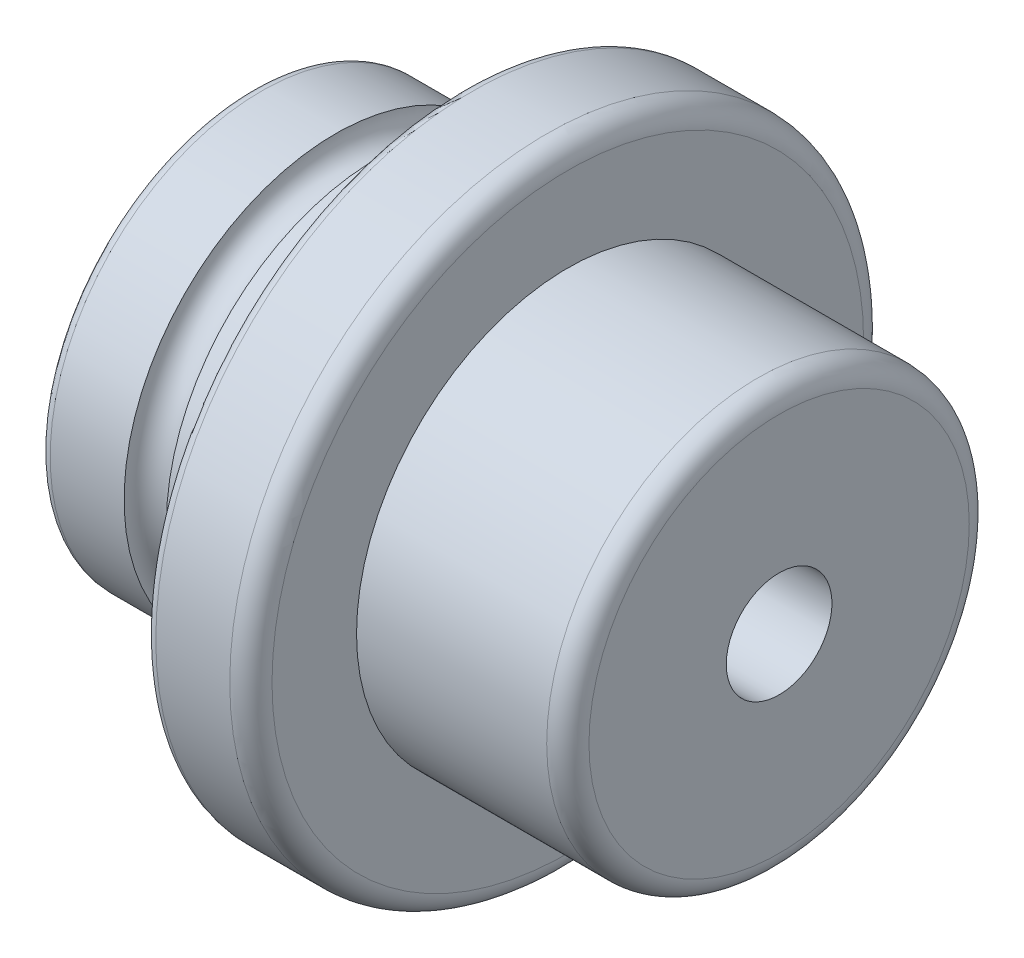
ISO-10303-21;
HEADER;
FILE_DESCRIPTION(('STEP AP214'),'2;1');
FILE_NAME('part.step','',(''),(''),'','','');
FILE_SCHEMA(('AUTOMOTIVE_DESIGN { 1 0 10303 214 1 1 1 1 }'));
ENDSEC;
DATA;
#1=APPLICATION_CONTEXT('core data for automotive mechanical design processes');
#2=APPLICATION_PROTOCOL_DEFINITION('international standard','automotive_design',2000,#1);
#3=PRODUCT_CONTEXT('',#1,'mechanical');
#4=PRODUCT('Part','Part','',(#3));
#5=PRODUCT_RELATED_PRODUCT_CATEGORY('part','',(#4));
#6=PRODUCT_DEFINITION_FORMATION('','',#4);
#7=PRODUCT_DEFINITION_CONTEXT('part definition',#1,'design');
#8=PRODUCT_DEFINITION('design','',#6,#7);
#9=PRODUCT_DEFINITION_SHAPE('','',#8);
#10=(LENGTH_UNIT() NAMED_UNIT(*) SI_UNIT(.MILLI.,.METRE.));
#11=(NAMED_UNIT(*) PLANE_ANGLE_UNIT() SI_UNIT($,.RADIAN.));
#12=(NAMED_UNIT(*) SI_UNIT($,.STERADIAN.) SOLID_ANGLE_UNIT());
#13=UNCERTAINTY_MEASURE_WITH_UNIT(LENGTH_MEASURE(1.E-05),#10,'distance_accuracy_value','');
#14=(GEOMETRIC_REPRESENTATION_CONTEXT(3) GLOBAL_UNCERTAINTY_ASSIGNED_CONTEXT((#13)) GLOBAL_UNIT_ASSIGNED_CONTEXT((#10,
#11,#12)) REPRESENTATION_CONTEXT('',''));
#15=CARTESIAN_POINT('',(0.,0.,0.));
#16=DIRECTION('',(0.,0.,1.));
#17=DIRECTION('',(1.,0.,0.));
#18=AXIS2_PLACEMENT_3D('',#15,#16,#17);
#19=CARTESIAN_POINT('',(0.,0.,0.));
#20=DIRECTION('',(-1.,0.,0.));
#21=DIRECTION('',(0.,0.,1.));
#22=AXIS2_PLACEMENT_3D('',#19,#20,#21);
#23=CYLINDRICAL_SURFACE('',#22,20.);
#24=CARTESIAN_POINT('',(12.,0.,0.));
#25=DIRECTION('',(-1.,0.,0.));
#26=DIRECTION('',(0.,0.,1.));
#27=AXIS2_PLACEMENT_3D('',#24,#25,#26);
#28=CIRCLE('',#27,20.);
#29=CARTESIAN_POINT('',(12.,0.,20.));
#30=VERTEX_POINT('',#29);
#31=EDGE_CURVE('E66',#30,#30,#28,.F.);
#32=ORIENTED_EDGE('',*,*,#31,.T.);
#33=EDGE_LOOP('',(#32));
#34=FACE_BOUND('',#33,.T.);
#35=CARTESIAN_POINT('',(20.,0.,0.));
#36=DIRECTION('',(-1.,0.,0.));
#37=DIRECTION('',(0.,0.,1.));
#38=AXIS2_PLACEMENT_3D('',#35,#36,#37);
#39=CIRCLE('',#38,20.);
#40=CARTESIAN_POINT('',(20.,0.,20.));
#41=VERTEX_POINT('',#40);
#42=EDGE_CURVE('E69',#41,#41,#39,.T.);
#43=ORIENTED_EDGE('',*,*,#42,.T.);
#44=EDGE_LOOP('',(#43));
#45=FACE_BOUND('',#44,.T.);
#46=ADVANCED_FACE('F33',(#34,#45),#23,.T.);
#47=CARTESIAN_POINT('',(0.,20.,0.));
#48=DIRECTION('',(1.,0.,0.));
#49=DIRECTION('',(0.,0.,-1.));
#50=AXIS2_PLACEMENT_3D('',#47,#48,#49);
#51=PLANE('',#50);
#52=CARTESIAN_POINT('',(0.,0.,0.));
#53=DIRECTION('',(1.,0.,0.));
#54=DIRECTION('',(0.,0.,-1.));
#55=AXIS2_PLACEMENT_3D('',#52,#53,#54);
#56=CIRCLE('',#55,19.);
#57=CARTESIAN_POINT('',(0.,0.,-19.));
#58=VERTEX_POINT('',#57);
#59=EDGE_CURVE('E62',#58,#58,#56,.F.);
#60=ORIENTED_EDGE('',*,*,#59,.T.);
#61=EDGE_LOOP('',(#60));
#62=FACE_BOUND('',#61,.T.);
#63=CARTESIAN_POINT('',(0.,0.,0.));
#64=DIRECTION('',(-1.,0.,0.));
#65=DIRECTION('',(0.,0.,1.));
#66=AXIS2_PLACEMENT_3D('',#63,#64,#65);
#67=CIRCLE('',#66,5.);
#68=CARTESIAN_POINT('',(0.,0.,5.));
#69=VERTEX_POINT('',#68);
#70=EDGE_CURVE('E65',#69,#69,#67,.T.);
#71=ORIENTED_EDGE('',*,*,#70,.F.);
#72=EDGE_LOOP('',(#71));
#73=FACE_BOUND('',#72,.T.);
#74=ADVANCED_FACE('F102',(#62,#73),#51,.F.);
#75=CARTESIAN_POINT('',(0.,0.,0.));
#76=DIRECTION('',(-1.,0.,0.));
#77=DIRECTION('',(0.,0.,1.));
#78=AXIS2_PLACEMENT_3D('',#75,#76,#77);
#79=CYLINDRICAL_SURFACE('',#78,5.);
#80=CARTESIAN_POINT('',(50.,0.,0.));
#81=DIRECTION('',(-1.,0.,0.));
#82=DIRECTION('',(0.,0.,1.));
#83=AXIS2_PLACEMENT_3D('',#80,#81,#82);
#84=CIRCLE('',#83,5.);
#85=CARTESIAN_POINT('',(50.,0.,5.));
#86=VERTEX_POINT('',#85);
#87=EDGE_CURVE('E75',#86,#86,#84,.T.);
#88=ORIENTED_EDGE('',*,*,#87,.F.);
#89=EDGE_LOOP('',(#88));
#90=FACE_BOUND('',#89,.T.);
#91=ORIENTED_EDGE('',*,*,#70,.T.);
#92=EDGE_LOOP('',(#91));
#93=FACE_BOUND('',#92,.T.);
#94=ADVANCED_FACE('F107',(#90,#93),#79,.F.);
#95=CARTESIAN_POINT('',(50.,5.,0.));
#96=DIRECTION('',(-1.,0.,0.));
#97=DIRECTION('',(0.,0.,1.));
#98=AXIS2_PLACEMENT_3D('',#95,#96,#97);
#99=PLANE('',#98);
#100=CARTESIAN_POINT('',(50.,0.,0.));
#101=DIRECTION('',(-1.,0.,0.));
#102=DIRECTION('',(0.,0.,1.));
#103=AXIS2_PLACEMENT_3D('',#100,#101,#102);
#104=CIRCLE('',#103,18.);
#105=CARTESIAN_POINT('',(50.,0.,18.));
#106=VERTEX_POINT('',#105);
#107=EDGE_CURVE('E10',#106,#106,#104,.F.);
#108=ORIENTED_EDGE('',*,*,#107,.T.);
#109=EDGE_LOOP('',(#108));
#110=FACE_BOUND('',#109,.T.);
#111=ORIENTED_EDGE('',*,*,#87,.T.);
#112=EDGE_LOOP('',(#111));
#113=FACE_BOUND('',#112,.T.);
#114=ADVANCED_FACE('F154',(#110,#113),#99,.F.);
#115=CARTESIAN_POINT('',(0.,0.,0.));
#116=DIRECTION('',(-1.,0.,0.));
#117=DIRECTION('',(0.,0.,1.));
#118=AXIS2_PLACEMENT_3D('',#115,#116,#117);
#119=CYLINDRICAL_SURFACE('',#118,20.);
#120=CARTESIAN_POINT('',(48.,0.,0.));
#121=DIRECTION('',(-1.,0.,0.));
#122=DIRECTION('',(0.,0.,1.));
#123=AXIS2_PLACEMENT_3D('',#120,#121,#122);
#124=CIRCLE('',#123,20.);
#125=CARTESIAN_POINT('',(48.,0.,20.));
#126=VERTEX_POINT('',#125);
#127=EDGE_CURVE('E40',#126,#126,#124,.T.);
#128=ORIENTED_EDGE('',*,*,#127,.T.);
#129=EDGE_LOOP('',(#128));
#130=FACE_BOUND('',#129,.T.);
#131=CARTESIAN_POINT('',(30.,0.,0.));
#132=DIRECTION('',(-1.,0.,0.));
#133=DIRECTION('',(0.,0.,1.));
#134=AXIS2_PLACEMENT_3D('',#131,#132,#133);
#135=CIRCLE('',#134,20.);
#136=CARTESIAN_POINT('',(30.,0.,20.));
#137=VERTEX_POINT('',#136);
#138=EDGE_CURVE('E78',#137,#137,#135,.T.);
#139=ORIENTED_EDGE('',*,*,#138,.F.);
#140=EDGE_LOOP('',(#139));
#141=FACE_BOUND('',#140,.T.);
#142=ADVANCED_FACE('F149',(#130,#141),#119,.T.);
#143=CARTESIAN_POINT('',(30.,20.,0.));
#144=DIRECTION('',(-1.,0.,0.));
#145=DIRECTION('',(0.,0.,1.));
#146=AXIS2_PLACEMENT_3D('',#143,#144,#145);
#147=PLANE('',#146);
#148=CARTESIAN_POINT('',(30.,0.,0.));
#149=DIRECTION('',(-1.,0.,0.));
#150=DIRECTION('',(0.,0.,1.));
#151=AXIS2_PLACEMENT_3D('',#148,#149,#150);
#152=CIRCLE('',#151,28.);
#153=CARTESIAN_POINT('',(30.,0.,28.));
#154=VERTEX_POINT('',#153);
#155=EDGE_CURVE('E44',#154,#154,#152,.F.);
#156=ORIENTED_EDGE('',*,*,#155,.T.);
#157=EDGE_LOOP('',(#156));
#158=FACE_BOUND('',#157,.T.);
#159=ORIENTED_EDGE('',*,*,#138,.T.);
#160=EDGE_LOOP('',(#159));
#161=FACE_BOUND('',#160,.T.);
#162=ADVANCED_FACE('F98',(#158,#161),#147,.F.);
#163=CARTESIAN_POINT('',(0.,0.,0.));
#164=DIRECTION('',(-1.,0.,0.));
#165=DIRECTION('',(0.,0.,1.));
#166=AXIS2_PLACEMENT_3D('',#163,#164,#165);
#167=CYLINDRICAL_SURFACE('',#166,30.);
#168=CARTESIAN_POINT('',(28.,0.,0.));
#169=DIRECTION('',(-1.,0.,0.));
#170=DIRECTION('',(0.,0.,1.));
#171=AXIS2_PLACEMENT_3D('',#168,#169,#170);
#172=CIRCLE('',#171,30.);
#173=CARTESIAN_POINT('',(28.,0.,30.));
#174=VERTEX_POINT('',#173);
#175=EDGE_CURVE('E48',#174,#174,#172,.T.);
#176=ORIENTED_EDGE('',*,*,#175,.T.);
#177=EDGE_LOOP('',(#176));
#178=FACE_BOUND('',#177,.T.);
#179=CARTESIAN_POINT('',(21.,0.,0.));
#180=DIRECTION('',(1.,0.,0.));
#181=DIRECTION('',(0.,0.,-1.));
#182=AXIS2_PLACEMENT_3D('',#179,#180,#181);
#183=CIRCLE('',#182,30.);
#184=CARTESIAN_POINT('',(21.,0.,-30.));
#185=VERTEX_POINT('',#184);
#186=EDGE_CURVE('E53',#185,#185,#183,.T.);
#187=ORIENTED_EDGE('',*,*,#186,.T.);
#188=EDGE_LOOP('',(#187));
#189=FACE_BOUND('',#188,.T.);
#190=ADVANCED_FACE('F88',(#178,#189),#167,.T.);
#191=CARTESIAN_POINT('',(20.,30.,0.));
#192=DIRECTION('',(1.,0.,0.));
#193=DIRECTION('',(0.,0.,-1.));
#194=AXIS2_PLACEMENT_3D('',#191,#192,#193);
#195=PLANE('',#194);
#196=CARTESIAN_POINT('',(20.,0.,0.));
#197=DIRECTION('',(1.,0.,0.));
#198=DIRECTION('',(0.,0.,-1.));
#199=AXIS2_PLACEMENT_3D('',#196,#197,#198);
#200=CIRCLE('',#199,29.);
#201=CARTESIAN_POINT('',(20.,0.,-29.));
#202=VERTEX_POINT('',#201);
#203=EDGE_CURVE('E56',#202,#202,#200,.F.);
#204=ORIENTED_EDGE('',*,*,#203,.T.);
#205=EDGE_LOOP('',(#204));
#206=FACE_BOUND('',#205,.T.);
#207=ORIENTED_EDGE('',*,*,#42,.F.);
#208=EDGE_LOOP('',(#207));
#209=FACE_BOUND('',#208,.T.);
#210=ADVANCED_FACE('F85',(#206,#209),#195,.F.);
#211=CARTESIAN_POINT('',(1.,0.,0.));
#212=DIRECTION('',(1.,0.,0.));
#213=DIRECTION('',(0.,0.,-1.));
#214=AXIS2_PLACEMENT_3D('',#211,#212,#213);
#215=CIRCLE('',#214,20.);
#216=CARTESIAN_POINT('',(1.,0.,-20.));
#217=VERTEX_POINT('',#216);
#218=EDGE_CURVE('E59',#217,#217,#215,.T.);
#219=ORIENTED_EDGE('',*,*,#218,.T.);
#220=EDGE_LOOP('',(#219));
#221=FACE_BOUND('',#220,.T.);
#222=CARTESIAN_POINT('',(8.,0.,0.));
#223=DIRECTION('',(1.,0.,0.));
#224=DIRECTION('',(0.,0.,-1.));
#225=AXIS2_PLACEMENT_3D('',#222,#223,#224);
#226=CIRCLE('',#225,20.);
#227=CARTESIAN_POINT('',(8.,0.,-20.));
#228=VERTEX_POINT('',#227);
#229=EDGE_CURVE('E70',#228,#228,#226,.F.);
#230=ORIENTED_EDGE('',*,*,#229,.T.);
#231=EDGE_LOOP('',(#230));
#232=FACE_BOUND('',#231,.T.);
#233=ADVANCED_FACE('F87',(#221,#232),#23,.T.);
#234=CARTESIAN_POINT('',(10.,0.,0.));
#235=DIRECTION('',(1.,0.,0.));
#236=DIRECTION('',(0.,0.,-1.));
#237=AXIS2_PLACEMENT_3D('',#234,#235,#236);
#238=TOROIDAL_SURFACE('',#237,20.,2.);
#239=ORIENTED_EDGE('',*,*,#229,.F.);
#240=EDGE_LOOP('',(#239));
#241=FACE_BOUND('',#240,.T.);
#242=ORIENTED_EDGE('',*,*,#31,.F.);
#243=EDGE_LOOP('',(#242));
#244=FACE_BOUND('',#243,.T.);
#245=ADVANCED_FACE('F95',(#241,#244),#238,.F.);
#246=CARTESIAN_POINT('',(1.,0.,0.));
#247=DIRECTION('',(1.,0.,0.));
#248=DIRECTION('',(0.,0.,-1.));
#249=AXIS2_PLACEMENT_3D('',#246,#247,#248);
#250=TOROIDAL_SURFACE('',#249,19.,1.);
#251=ORIENTED_EDGE('',*,*,#218,.F.);
#252=EDGE_LOOP('',(#251));
#253=FACE_BOUND('',#252,.T.);
#254=ORIENTED_EDGE('',*,*,#59,.F.);
#255=EDGE_LOOP('',(#254));
#256=FACE_BOUND('',#255,.T.);
#257=ADVANCED_FACE('F112',(#253,#256),#250,.T.);
#258=CARTESIAN_POINT('',(21.,0.,0.));
#259=DIRECTION('',(1.,0.,0.));
#260=DIRECTION('',(0.,0.,-1.));
#261=AXIS2_PLACEMENT_3D('',#258,#259,#260);
#262=TOROIDAL_SURFACE('',#261,29.,1.);
#263=ORIENTED_EDGE('',*,*,#186,.F.);
#264=EDGE_LOOP('',(#263));
#265=FACE_BOUND('',#264,.T.);
#266=ORIENTED_EDGE('',*,*,#203,.F.);
#267=EDGE_LOOP('',(#266));
#268=FACE_BOUND('',#267,.T.);
#269=ADVANCED_FACE('F117',(#265,#268),#262,.T.);
#270=CARTESIAN_POINT('',(28.,0.,0.));
#271=DIRECTION('',(-1.,0.,0.));
#272=DIRECTION('',(0.,0.,1.));
#273=AXIS2_PLACEMENT_3D('',#270,#271,#272);
#274=TOROIDAL_SURFACE('',#273,28.,2.);
#275=ORIENTED_EDGE('',*,*,#155,.F.);
#276=EDGE_LOOP('',(#275));
#277=FACE_BOUND('',#276,.T.);
#278=ORIENTED_EDGE('',*,*,#175,.F.);
#279=EDGE_LOOP('',(#278));
#280=FACE_BOUND('',#279,.T.);
#281=ADVANCED_FACE('F127',(#277,#280),#274,.T.);
#282=CARTESIAN_POINT('',(48.,0.,0.));
#283=DIRECTION('',(-1.,0.,0.));
#284=DIRECTION('',(0.,0.,1.));
#285=AXIS2_PLACEMENT_3D('',#282,#283,#284);
#286=TOROIDAL_SURFACE('',#285,18.,2.);
#287=ORIENTED_EDGE('',*,*,#107,.F.);
#288=EDGE_LOOP('',(#287));
#289=FACE_BOUND('',#288,.T.);
#290=ORIENTED_EDGE('',*,*,#127,.F.);
#291=EDGE_LOOP('',(#290));
#292=FACE_BOUND('',#291,.T.);
#293=ADVANCED_FACE('F35',(#289,#292),#286,.T.);
#294=CLOSED_SHELL('',(#46,#74,#94,#114,#142,#162,#190,#210,#233,#245,#257,#269,#281,#293));
#295=MANIFOLD_SOLID_BREP('B2',#294);
#296=ADVANCED_BREP_SHAPE_REPRESENTATION('',(#18,#295),#14);
#297=SHAPE_DEFINITION_REPRESENTATION(#9,#296);
ENDSEC;
END-ISO-10303-21;
